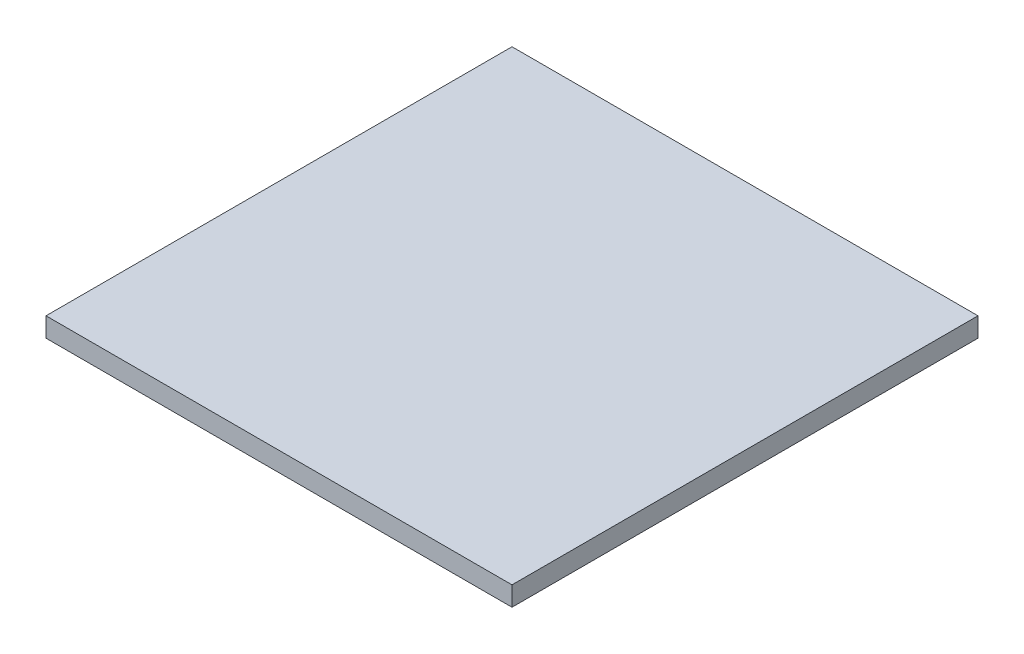
ISO-10303-21;
HEADER;
FILE_DESCRIPTION(('STEP AP214'),'2;1');
FILE_NAME('part.step','',(''),(''),'','','');
FILE_SCHEMA(('AUTOMOTIVE_DESIGN { 1 0 10303 214 1 1 1 1 }'));
ENDSEC;
DATA;
#1=APPLICATION_CONTEXT('core data for automotive mechanical design processes');
#2=APPLICATION_PROTOCOL_DEFINITION('international standard','automotive_design',2000,#1);
#3=PRODUCT_CONTEXT('',#1,'mechanical');
#4=PRODUCT('Part','Part','',(#3));
#5=PRODUCT_RELATED_PRODUCT_CATEGORY('part','',(#4));
#6=PRODUCT_DEFINITION_FORMATION('','',#4);
#7=PRODUCT_DEFINITION_CONTEXT('part definition',#1,'design');
#8=PRODUCT_DEFINITION('design','',#6,#7);
#9=PRODUCT_DEFINITION_SHAPE('','',#8);
#10=(LENGTH_UNIT() NAMED_UNIT(*) SI_UNIT(.MILLI.,.METRE.));
#11=(NAMED_UNIT(*) PLANE_ANGLE_UNIT() SI_UNIT($,.RADIAN.));
#12=(NAMED_UNIT(*) SI_UNIT($,.STERADIAN.) SOLID_ANGLE_UNIT());
#13=UNCERTAINTY_MEASURE_WITH_UNIT(LENGTH_MEASURE(1.E-05),#10,'distance_accuracy_value','');
#14=(GEOMETRIC_REPRESENTATION_CONTEXT(3) GLOBAL_UNCERTAINTY_ASSIGNED_CONTEXT((#13)) GLOBAL_UNIT_ASSIGNED_CONTEXT((#10,
#11,#12)) REPRESENTATION_CONTEXT('',''));
#15=CARTESIAN_POINT('',(0.,0.,0.));
#16=DIRECTION('',(0.,0.,1.));
#17=DIRECTION('',(1.,0.,0.));
#18=AXIS2_PLACEMENT_3D('',#15,#16,#17);
#19=CARTESIAN_POINT('',(0.,3.17500000000004,0.));
#20=DIRECTION('',(1.,0.,0.));
#21=DIRECTION('',(0.,0.,-1.));
#22=AXIS2_PLACEMENT_3D('',#19,#20,#21);
#23=PLANE('',#22);
#24=DIRECTION('',(0.,0.,1.));
#25=VECTOR('',#24,1.);
#26=CARTESIAN_POINT('',(0.,0.,0.));
#27=LINE('',#26,#25);
#28=CARTESIAN_POINT('',(0.,0.,-76.2));
#29=VERTEX_POINT('',#28);
#30=CARTESIAN_POINT('',(0.,0.,0.));
#31=VERTEX_POINT('',#30);
#32=EDGE_CURVE('E93',#29,#31,#27,.T.);
#33=ORIENTED_EDGE('',*,*,#32,.T.);
#34=DIRECTION('',(0.,-1.,0.));
#35=VECTOR('',#34,1.);
#36=CARTESIAN_POINT('',(0.,3.17500000000004,0.));
#37=LINE('',#36,#35);
#38=CARTESIAN_POINT('',(0.,3.17500000000004,0.));
#39=VERTEX_POINT('',#38);
#40=EDGE_CURVE('E11',#39,#31,#37,.T.);
#41=ORIENTED_EDGE('',*,*,#40,.F.);
#42=DIRECTION('',(0.,0.,1.));
#43=VECTOR('',#42,1.);
#44=CARTESIAN_POINT('',(0.,3.17500000000004,0.));
#45=LINE('',#44,#43);
#46=CARTESIAN_POINT('',(0.,3.17500000000004,-76.2));
#47=VERTEX_POINT('',#46);
#48=EDGE_CURVE('E81',#47,#39,#45,.T.);
#49=ORIENTED_EDGE('',*,*,#48,.F.);
#50=DIRECTION('',(0.,-1.,0.));
#51=VECTOR('',#50,1.);
#52=CARTESIAN_POINT('',(0.,3.17500000000004,-76.2));
#53=LINE('',#52,#51);
#54=EDGE_CURVE('E89',#47,#29,#53,.T.);
#55=ORIENTED_EDGE('',*,*,#54,.T.);
#56=EDGE_LOOP('',(#33,#41,#49,#55));
#57=FACE_BOUND('',#56,.T.);
#58=ADVANCED_FACE('F30',(#57),#23,.F.);
#59=CARTESIAN_POINT('',(0.,3.17500000000004,0.));
#60=DIRECTION('',(0.,0.,-1.));
#61=DIRECTION('',(-1.,0.,0.));
#62=AXIS2_PLACEMENT_3D('',#59,#60,#61);
#63=PLANE('',#62);
#64=DIRECTION('',(1.,0.,0.));
#65=VECTOR('',#64,1.);
#66=CARTESIAN_POINT('',(0.,0.,0.));
#67=LINE('',#66,#65);
#68=CARTESIAN_POINT('',(76.2,0.,0.));
#69=VERTEX_POINT('',#68);
#70=EDGE_CURVE('E85',#31,#69,#67,.T.);
#71=ORIENTED_EDGE('',*,*,#70,.T.);
#72=DIRECTION('',(0.,-1.,0.));
#73=VECTOR('',#72,1.);
#74=CARTESIAN_POINT('',(76.2,3.17500000000004,0.));
#75=LINE('',#74,#73);
#76=CARTESIAN_POINT('',(76.2,3.17500000000004,0.));
#77=VERTEX_POINT('',#76);
#78=EDGE_CURVE('E38',#77,#69,#75,.T.);
#79=ORIENTED_EDGE('',*,*,#78,.F.);
#80=DIRECTION('',(1.,0.,0.));
#81=VECTOR('',#80,1.);
#82=CARTESIAN_POINT('',(0.,3.17500000000004,0.));
#83=LINE('',#82,#81);
#84=EDGE_CURVE('E76',#39,#77,#83,.T.);
#85=ORIENTED_EDGE('',*,*,#84,.F.);
#86=ORIENTED_EDGE('',*,*,#40,.T.);
#87=EDGE_LOOP('',(#71,#79,#85,#86));
#88=FACE_BOUND('',#87,.T.);
#89=ADVANCED_FACE('F84',(#88),#63,.F.);
#90=CARTESIAN_POINT('',(76.2,3.17500000000004,0.));
#91=DIRECTION('',(-1.,0.,0.));
#92=DIRECTION('',(0.,0.,1.));
#93=AXIS2_PLACEMENT_3D('',#90,#91,#92);
#94=PLANE('',#93);
#95=DIRECTION('',(0.,0.,-1.));
#96=VECTOR('',#95,1.);
#97=CARTESIAN_POINT('',(76.2,0.,0.));
#98=LINE('',#97,#96);
#99=CARTESIAN_POINT('',(76.2,0.,-76.2));
#100=VERTEX_POINT('',#99);
#101=EDGE_CURVE('E63',#69,#100,#98,.T.);
#102=ORIENTED_EDGE('',*,*,#101,.T.);
#103=DIRECTION('',(0.,-1.,0.));
#104=VECTOR('',#103,1.);
#105=CARTESIAN_POINT('',(76.2,3.17500000000004,-76.2));
#106=LINE('',#105,#104);
#107=CARTESIAN_POINT('',(76.2,3.17500000000004,-76.2));
#108=VERTEX_POINT('',#107);
#109=EDGE_CURVE('E86',#108,#100,#106,.T.);
#110=ORIENTED_EDGE('',*,*,#109,.F.);
#111=DIRECTION('',(0.,0.,-1.));
#112=VECTOR('',#111,1.);
#113=CARTESIAN_POINT('',(76.2,3.17500000000004,0.));
#114=LINE('',#113,#112);
#115=EDGE_CURVE('E79',#77,#108,#114,.T.);
#116=ORIENTED_EDGE('',*,*,#115,.F.);
#117=ORIENTED_EDGE('',*,*,#78,.T.);
#118=EDGE_LOOP('',(#102,#110,#116,#117));
#119=FACE_BOUND('',#118,.T.);
#120=ADVANCED_FACE('F87',(#119),#94,.F.);
#121=CARTESIAN_POINT('',(0.,3.17500000000004,-76.2));
#122=DIRECTION('',(0.,0.,1.));
#123=DIRECTION('',(1.,0.,0.));
#124=AXIS2_PLACEMENT_3D('',#121,#122,#123);
#125=PLANE('',#124);
#126=DIRECTION('',(-1.,0.,0.));
#127=VECTOR('',#126,1.);
#128=CARTESIAN_POINT('',(0.,0.,-76.2));
#129=LINE('',#128,#127);
#130=EDGE_CURVE('E69',#100,#29,#129,.T.);
#131=ORIENTED_EDGE('',*,*,#130,.T.);
#132=ORIENTED_EDGE('',*,*,#54,.F.);
#133=DIRECTION('',(-1.,0.,0.));
#134=VECTOR('',#133,1.);
#135=CARTESIAN_POINT('',(0.,3.17500000000004,-76.2));
#136=LINE('',#135,#134);
#137=EDGE_CURVE('E46',#108,#47,#136,.T.);
#138=ORIENTED_EDGE('',*,*,#137,.F.);
#139=ORIENTED_EDGE('',*,*,#109,.T.);
#140=EDGE_LOOP('',(#131,#132,#138,#139));
#141=FACE_BOUND('',#140,.T.);
#142=ADVANCED_FACE('F100',(#141),#125,.F.);
#143=CARTESIAN_POINT('',(0.,3.17500000000004,0.));
#144=DIRECTION('',(0.,-1.,0.));
#145=DIRECTION('',(0.,0.,-1.));
#146=AXIS2_PLACEMENT_3D('',#143,#144,#145);
#147=PLANE('',#146);
#148=ORIENTED_EDGE('',*,*,#48,.T.);
#149=ORIENTED_EDGE('',*,*,#84,.T.);
#150=ORIENTED_EDGE('',*,*,#115,.T.);
#151=ORIENTED_EDGE('',*,*,#137,.T.);
#152=EDGE_LOOP('',(#148,#149,#150,#151));
#153=FACE_BOUND('',#152,.T.);
#154=ADVANCED_FACE('F77',(#153),#147,.F.);
#155=CARTESIAN_POINT('',(0.,0.,0.));
#156=DIRECTION('',(0.,-1.,0.));
#157=DIRECTION('',(0.,0.,-1.));
#158=AXIS2_PLACEMENT_3D('',#155,#156,#157);
#159=PLANE('',#158);
#160=ORIENTED_EDGE('',*,*,#32,.F.);
#161=ORIENTED_EDGE('',*,*,#130,.F.);
#162=ORIENTED_EDGE('',*,*,#101,.F.);
#163=ORIENTED_EDGE('',*,*,#70,.F.);
#164=EDGE_LOOP('',(#160,#161,#162,#163));
#165=FACE_BOUND('',#164,.T.);
#166=ADVANCED_FACE('F103',(#165),#159,.T.);
#167=CLOSED_SHELL('',(#58,#89,#120,#142,#154,#166));
#168=MANIFOLD_SOLID_BREP('B2',#167);
#169=ADVANCED_BREP_SHAPE_REPRESENTATION('',(#18,#168),#14);
#170=SHAPE_DEFINITION_REPRESENTATION(#9,#169);
ENDSEC;
END-ISO-10303-21;
